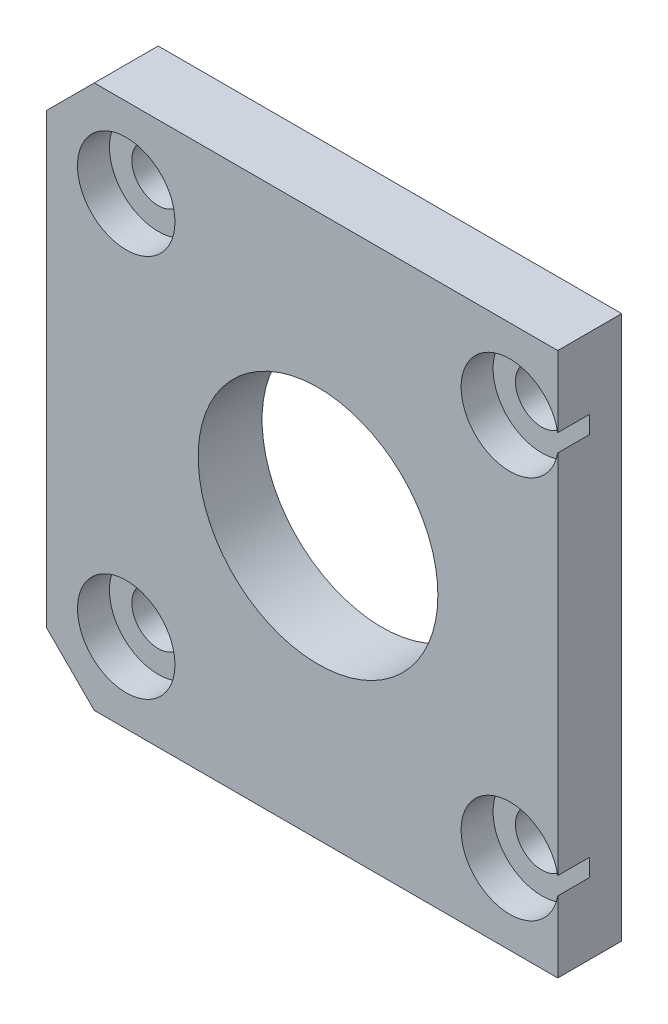
ISO-10303-21;
HEADER;
FILE_DESCRIPTION(('STEP AP214'),'2;1');
FILE_NAME('part.step','',(''),(''),'','','');
FILE_SCHEMA(('AUTOMOTIVE_DESIGN { 1 0 10303 214 1 1 1 1 }'));
ENDSEC;
DATA;
#1=APPLICATION_CONTEXT('core data for automotive mechanical design processes');
#2=APPLICATION_PROTOCOL_DEFINITION('international standard','automotive_design',2000,#1);
#3=PRODUCT_CONTEXT('',#1,'mechanical');
#4=PRODUCT('Part','Part','',(#3));
#5=PRODUCT_RELATED_PRODUCT_CATEGORY('part','',(#4));
#6=PRODUCT_DEFINITION_FORMATION('','',#4);
#7=PRODUCT_DEFINITION_CONTEXT('part definition',#1,'design');
#8=PRODUCT_DEFINITION('design','',#6,#7);
#9=PRODUCT_DEFINITION_SHAPE('','',#8);
#10=(LENGTH_UNIT() NAMED_UNIT(*) SI_UNIT(.MILLI.,.METRE.));
#11=(NAMED_UNIT(*) PLANE_ANGLE_UNIT() SI_UNIT($,.RADIAN.));
#12=(NAMED_UNIT(*) SI_UNIT($,.STERADIAN.) SOLID_ANGLE_UNIT());
#13=UNCERTAINTY_MEASURE_WITH_UNIT(LENGTH_MEASURE(1.E-05),#10,'distance_accuracy_value','');
#14=(GEOMETRIC_REPRESENTATION_CONTEXT(3) GLOBAL_UNCERTAINTY_ASSIGNED_CONTEXT((#13)) GLOBAL_UNIT_ASSIGNED_CONTEXT((#10,
#11,#12)) REPRESENTATION_CONTEXT('',''));
#15=CARTESIAN_POINT('',(0.,0.,0.));
#16=DIRECTION('',(0.,0.,1.));
#17=DIRECTION('',(1.,0.,0.));
#18=AXIS2_PLACEMENT_3D('',#15,#16,#17);
#19=CARTESIAN_POINT('',(5.,29.,4.));
#20=DIRECTION('',(0.,0.,-1.));
#21=DIRECTION('',(-1.,0.,0.));
#22=AXIS2_PLACEMENT_3D('',#19,#20,#21);
#23=CYLINDRICAL_SURFACE('',#22,1.65);
#24=CARTESIAN_POINT('',(5.,29.,0.));
#25=DIRECTION('',(0.,0.,1.));
#26=DIRECTION('',(1.,0.,0.));
#27=AXIS2_PLACEMENT_3D('',#24,#25,#26);
#28=CIRCLE('',#27,1.65);
#29=CARTESIAN_POINT('',(6.65,29.,0.));
#30=VERTEX_POINT('',#29);
#31=EDGE_CURVE('E271',#30,#30,#28,.T.);
#32=ORIENTED_EDGE('',*,*,#31,.F.);
#33=EDGE_LOOP('',(#32));
#34=FACE_BOUND('',#33,.T.);
#35=CARTESIAN_POINT('',(5.,29.,2.));
#36=DIRECTION('',(0.,0.,1.));
#37=DIRECTION('',(1.,0.,0.));
#38=AXIS2_PLACEMENT_3D('',#35,#36,#37);
#39=CIRCLE('',#38,1.65);
#40=CARTESIAN_POINT('',(6.65,29.,2.));
#41=VERTEX_POINT('',#40);
#42=EDGE_CURVE('E222',#41,#41,#39,.T.);
#43=ORIENTED_EDGE('',*,*,#42,.T.);
#44=EDGE_LOOP('',(#43));
#45=FACE_BOUND('',#44,.T.);
#46=ADVANCED_FACE('F39',(#34,#45),#23,.F.);
#47=CARTESIAN_POINT('',(29.,29.,4.));
#48=DIRECTION('',(0.,0.,-1.));
#49=DIRECTION('',(-1.,0.,0.));
#50=AXIS2_PLACEMENT_3D('',#47,#48,#49);
#51=CYLINDRICAL_SURFACE('',#50,1.65);
#52=CARTESIAN_POINT('',(29.,29.,0.));
#53=DIRECTION('',(0.,0.,1.));
#54=DIRECTION('',(1.,0.,0.));
#55=AXIS2_PLACEMENT_3D('',#52,#53,#54);
#56=CIRCLE('',#55,1.65);
#57=CARTESIAN_POINT('',(30.65,29.,0.));
#58=VERTEX_POINT('',#57);
#59=EDGE_CURVE('E267',#58,#58,#56,.T.);
#60=ORIENTED_EDGE('',*,*,#59,.F.);
#61=EDGE_LOOP('',(#60));
#62=FACE_BOUND('',#61,.T.);
#63=CARTESIAN_POINT('',(29.,29.,2.));
#64=DIRECTION('',(0.,0.,1.));
#65=DIRECTION('',(1.,0.,0.));
#66=AXIS2_PLACEMENT_3D('',#63,#64,#65);
#67=CIRCLE('',#66,1.65);
#68=CARTESIAN_POINT('',(30.65,29.,2.));
#69=VERTEX_POINT('',#68);
#70=EDGE_CURVE('E217',#69,#69,#67,.T.);
#71=ORIENTED_EDGE('',*,*,#70,.T.);
#72=EDGE_LOOP('',(#71));
#73=FACE_BOUND('',#72,.T.);
#74=ADVANCED_FACE('F301',(#62,#73),#51,.F.);
#75=CARTESIAN_POINT('',(5.,5.,4.));
#76=DIRECTION('',(0.,0.,-1.));
#77=DIRECTION('',(-1.,0.,0.));
#78=AXIS2_PLACEMENT_3D('',#75,#76,#77);
#79=CYLINDRICAL_SURFACE('',#78,1.65);
#80=CARTESIAN_POINT('',(5.,5.,0.));
#81=DIRECTION('',(0.,0.,1.));
#82=DIRECTION('',(1.,0.,0.));
#83=AXIS2_PLACEMENT_3D('',#80,#81,#82);
#84=CIRCLE('',#83,1.65);
#85=CARTESIAN_POINT('',(6.65,5.,0.));
#86=VERTEX_POINT('',#85);
#87=EDGE_CURVE('E263',#86,#86,#84,.T.);
#88=ORIENTED_EDGE('',*,*,#87,.F.);
#89=EDGE_LOOP('',(#88));
#90=FACE_BOUND('',#89,.T.);
#91=CARTESIAN_POINT('',(5.,5.,2.));
#92=DIRECTION('',(0.,0.,1.));
#93=DIRECTION('',(1.,0.,0.));
#94=AXIS2_PLACEMENT_3D('',#91,#92,#93);
#95=CIRCLE('',#94,1.65);
#96=CARTESIAN_POINT('',(6.65,5.,2.));
#97=VERTEX_POINT('',#96);
#98=EDGE_CURVE('E213',#97,#97,#95,.T.);
#99=ORIENTED_EDGE('',*,*,#98,.T.);
#100=EDGE_LOOP('',(#99));
#101=FACE_BOUND('',#100,.T.);
#102=ADVANCED_FACE('F306',(#90,#101),#79,.F.);
#103=CARTESIAN_POINT('',(29.,5.,4.));
#104=DIRECTION('',(0.,0.,-1.));
#105=DIRECTION('',(-1.,0.,0.));
#106=AXIS2_PLACEMENT_3D('',#103,#104,#105);
#107=CYLINDRICAL_SURFACE('',#106,1.65);
#108=CARTESIAN_POINT('',(29.,5.,0.));
#109=DIRECTION('',(0.,0.,1.));
#110=DIRECTION('',(1.,0.,0.));
#111=AXIS2_PLACEMENT_3D('',#108,#109,#110);
#112=CIRCLE('',#111,1.65);
#113=CARTESIAN_POINT('',(30.65,5.,0.));
#114=VERTEX_POINT('',#113);
#115=EDGE_CURVE('E225',#114,#114,#112,.T.);
#116=ORIENTED_EDGE('',*,*,#115,.F.);
#117=EDGE_LOOP('',(#116));
#118=FACE_BOUND('',#117,.T.);
#119=CARTESIAN_POINT('',(29.,5.,2.));
#120=DIRECTION('',(0.,0.,1.));
#121=DIRECTION('',(1.,0.,0.));
#122=AXIS2_PLACEMENT_3D('',#119,#120,#121);
#123=CIRCLE('',#122,1.65);
#124=CARTESIAN_POINT('',(30.65,5.,2.));
#125=VERTEX_POINT('',#124);
#126=EDGE_CURVE('E207',#125,#125,#123,.T.);
#127=ORIENTED_EDGE('',*,*,#126,.T.);
#128=EDGE_LOOP('',(#127));
#129=FACE_BOUND('',#128,.T.);
#130=ADVANCED_FACE('F314',(#118,#129),#107,.F.);
#131=CARTESIAN_POINT('',(0.,0.,4.));
#132=DIRECTION('',(0.,0.,-1.));
#133=DIRECTION('',(-1.,0.,0.));
#134=AXIS2_PLACEMENT_3D('',#131,#132,#133);
#135=PLANE('',#134);
#136=CARTESIAN_POINT('',(5.,5.,4.));
#137=DIRECTION('',(0.,0.,1.));
#138=DIRECTION('',(1.,0.,0.));
#139=AXIS2_PLACEMENT_3D('',#136,#137,#138);
#140=CIRCLE('',#139,3.05);
#141=CARTESIAN_POINT('',(8.05,5.,4.));
#142=VERTEX_POINT('',#141);
#143=EDGE_CURVE('E244',#142,#142,#140,.T.);
#144=ORIENTED_EDGE('',*,*,#143,.F.);
#145=EDGE_LOOP('',(#144));
#146=FACE_BOUND('',#145,.T.);
#147=CARTESIAN_POINT('',(5.,29.,4.));
#148=DIRECTION('',(0.,0.,1.));
#149=DIRECTION('',(1.,0.,0.));
#150=AXIS2_PLACEMENT_3D('',#147,#148,#149);
#151=CIRCLE('',#150,3.05);
#152=CARTESIAN_POINT('',(8.05,29.,4.));
#153=VERTEX_POINT('',#152);
#154=EDGE_CURVE('E241',#153,#153,#151,.T.);
#155=ORIENTED_EDGE('',*,*,#154,.F.);
#156=EDGE_LOOP('',(#155));
#157=FACE_BOUND('',#156,.T.);
#158=DIRECTION('',(0.,1.,0.));
#159=VECTOR('',#158,1.);
#160=CARTESIAN_POINT('',(32.,0.,4.));
#161=LINE('',#160,#159);
#162=CARTESIAN_POINT('',(32.,5.55000000000001,4.));
#163=VERTEX_POINT('',#162);
#164=CARTESIAN_POINT('',(32.,28.45,4.));
#165=VERTEX_POINT('',#164);
#166=EDGE_CURVE('E134',#163,#165,#161,.T.);
#167=ORIENTED_EDGE('',*,*,#166,.T.);
#168=CARTESIAN_POINT('',(29.,29.,4.));
#169=DIRECTION('',(0.,0.,1.));
#170=DIRECTION('',(1.,0.,0.));
#171=AXIS2_PLACEMENT_3D('',#168,#169,#170);
#172=CIRCLE('',#171,3.05);
#173=CARTESIAN_POINT('',(32.,29.55,4.));
#174=VERTEX_POINT('',#173);
#175=EDGE_CURVE('E234',#174,#165,#172,.T.);
#176=ORIENTED_EDGE('',*,*,#175,.F.);
#177=CARTESIAN_POINT('',(32.,34.,4.));
#178=VERTEX_POINT('',#177);
#179=EDGE_CURVE('E141',#174,#178,#161,.T.);
#180=ORIENTED_EDGE('',*,*,#179,.T.);
#181=DIRECTION('',(-1.,0.,0.));
#182=VECTOR('',#181,1.);
#183=CARTESIAN_POINT('',(3.,34.,4.));
#184=LINE('',#183,#182);
#185=CARTESIAN_POINT('',(3.,34.,4.));
#186=VERTEX_POINT('',#185);
#187=EDGE_CURVE('E145',#178,#186,#184,.T.);
#188=ORIENTED_EDGE('',*,*,#187,.T.);
#189=DIRECTION('',(-0.707106781186548,-0.707106781186547,0.));
#190=VECTOR('',#189,1.);
#191=CARTESIAN_POINT('',(0.,31.,4.));
#192=LINE('',#191,#190);
#193=CARTESIAN_POINT('',(0.,31.,4.));
#194=VERTEX_POINT('',#193);
#195=EDGE_CURVE('E153',#186,#194,#192,.T.);
#196=ORIENTED_EDGE('',*,*,#195,.T.);
#197=DIRECTION('',(0.,-1.,0.));
#198=VECTOR('',#197,1.);
#199=CARTESIAN_POINT('',(0.,3.,4.));
#200=LINE('',#199,#198);
#201=CARTESIAN_POINT('',(0.,3.,4.));
#202=VERTEX_POINT('',#201);
#203=EDGE_CURVE('E156',#194,#202,#200,.T.);
#204=ORIENTED_EDGE('',*,*,#203,.T.);
#205=DIRECTION('',(0.707106781186548,-0.707106781186548,0.));
#206=VECTOR('',#205,1.);
#207=CARTESIAN_POINT('',(0.,3.,4.));
#208=LINE('',#207,#206);
#209=CARTESIAN_POINT('',(3.,0.,4.));
#210=VERTEX_POINT('',#209);
#211=EDGE_CURVE('E159',#202,#210,#208,.T.);
#212=ORIENTED_EDGE('',*,*,#211,.T.);
#213=DIRECTION('',(1.,0.,0.));
#214=VECTOR('',#213,1.);
#215=CARTESIAN_POINT('',(3.,0.,4.));
#216=LINE('',#215,#214);
#217=CARTESIAN_POINT('',(32.,0.,4.));
#218=VERTEX_POINT('',#217);
#219=EDGE_CURVE('E162',#210,#218,#216,.T.);
#220=ORIENTED_EDGE('',*,*,#219,.T.);
#221=CARTESIAN_POINT('',(32.,4.44999999999999,4.));
#222=VERTEX_POINT('',#221);
#223=EDGE_CURVE('E136',#218,#222,#161,.T.);
#224=ORIENTED_EDGE('',*,*,#223,.T.);
#225=CARTESIAN_POINT('',(29.,5.,4.));
#226=DIRECTION('',(0.,0.,1.));
#227=DIRECTION('',(1.,0.,0.));
#228=AXIS2_PLACEMENT_3D('',#225,#226,#227);
#229=CIRCLE('',#228,3.05);
#230=EDGE_CURVE('E119',#163,#222,#229,.T.);
#231=ORIENTED_EDGE('',*,*,#230,.F.);
#232=EDGE_LOOP('',(#167,#176,#180,#188,#196,#204,#212,#220,#224,#231));
#233=FACE_BOUND('',#232,.T.);
#234=CARTESIAN_POINT('',(17.,17.,4.));
#235=DIRECTION('',(0.,0.,1.));
#236=DIRECTION('',(1.,0.,0.));
#237=AXIS2_PLACEMENT_3D('',#234,#235,#236);
#238=CIRCLE('',#237,7.5);
#239=CARTESIAN_POINT('',(24.5,17.,4.));
#240=VERTEX_POINT('',#239);
#241=EDGE_CURVE('E171',#240,#240,#238,.T.);
#242=ORIENTED_EDGE('',*,*,#241,.F.);
#243=EDGE_LOOP('',(#242));
#244=FACE_BOUND('',#243,.T.);
#245=ADVANCED_FACE('F131',(#146,#157,#233,#244),#135,.F.);
#246=CARTESIAN_POINT('',(0.,0.,0.));
#247=DIRECTION('',(0.,0.,-1.));
#248=DIRECTION('',(-1.,0.,0.));
#249=AXIS2_PLACEMENT_3D('',#246,#247,#248);
#250=PLANE('',#249);
#251=ORIENTED_EDGE('',*,*,#87,.T.);
#252=EDGE_LOOP('',(#251));
#253=FACE_BOUND('',#252,.T.);
#254=ORIENTED_EDGE('',*,*,#31,.T.);
#255=EDGE_LOOP('',(#254));
#256=FACE_BOUND('',#255,.T.);
#257=DIRECTION('',(0.,1.,0.));
#258=VECTOR('',#257,1.);
#259=CARTESIAN_POINT('',(32.,0.,0.));
#260=LINE('',#259,#258);
#261=CARTESIAN_POINT('',(32.,0.,0.));
#262=VERTEX_POINT('',#261);
#263=CARTESIAN_POINT('',(32.,34.,0.));
#264=VERTEX_POINT('',#263);
#265=EDGE_CURVE('E166',#262,#264,#260,.T.);
#266=ORIENTED_EDGE('',*,*,#265,.F.);
#267=DIRECTION('',(1.,0.,0.));
#268=VECTOR('',#267,1.);
#269=CARTESIAN_POINT('',(3.,0.,0.));
#270=LINE('',#269,#268);
#271=CARTESIAN_POINT('',(3.,0.,0.));
#272=VERTEX_POINT('',#271);
#273=EDGE_CURVE('E146',#272,#262,#270,.T.);
#274=ORIENTED_EDGE('',*,*,#273,.F.);
#275=DIRECTION('',(0.707106781186548,-0.707106781186548,0.));
#276=VECTOR('',#275,1.);
#277=CARTESIAN_POINT('',(0.,3.,0.));
#278=LINE('',#277,#276);
#279=CARTESIAN_POINT('',(0.,3.,0.));
#280=VERTEX_POINT('',#279);
#281=EDGE_CURVE('E180',#280,#272,#278,.T.);
#282=ORIENTED_EDGE('',*,*,#281,.F.);
#283=DIRECTION('',(0.,-1.,0.));
#284=VECTOR('',#283,1.);
#285=CARTESIAN_POINT('',(0.,3.,0.));
#286=LINE('',#285,#284);
#287=CARTESIAN_POINT('',(0.,31.,0.));
#288=VERTEX_POINT('',#287);
#289=EDGE_CURVE('E177',#288,#280,#286,.T.);
#290=ORIENTED_EDGE('',*,*,#289,.F.);
#291=DIRECTION('',(-0.707106781186548,-0.707106781186547,0.));
#292=VECTOR('',#291,1.);
#293=CARTESIAN_POINT('',(0.,31.,0.));
#294=LINE('',#293,#292);
#295=CARTESIAN_POINT('',(3.,34.,0.));
#296=VERTEX_POINT('',#295);
#297=EDGE_CURVE('E174',#296,#288,#294,.T.);
#298=ORIENTED_EDGE('',*,*,#297,.F.);
#299=DIRECTION('',(-1.,0.,0.));
#300=VECTOR('',#299,1.);
#301=CARTESIAN_POINT('',(3.,34.,0.));
#302=LINE('',#301,#300);
#303=EDGE_CURVE('E170',#264,#296,#302,.T.);
#304=ORIENTED_EDGE('',*,*,#303,.F.);
#305=EDGE_LOOP('',(#266,#274,#282,#290,#298,#304));
#306=FACE_BOUND('',#305,.T.);
#307=CARTESIAN_POINT('',(17.,17.,0.));
#308=DIRECTION('',(0.,0.,1.));
#309=DIRECTION('',(1.,0.,0.));
#310=AXIS2_PLACEMENT_3D('',#307,#308,#309);
#311=CIRCLE('',#310,7.5);
#312=CARTESIAN_POINT('',(24.5,17.,0.));
#313=VERTEX_POINT('',#312);
#314=EDGE_CURVE('E149',#313,#313,#311,.T.);
#315=ORIENTED_EDGE('',*,*,#314,.T.);
#316=EDGE_LOOP('',(#315));
#317=FACE_BOUND('',#316,.T.);
#318=ORIENTED_EDGE('',*,*,#59,.T.);
#319=EDGE_LOOP('',(#318));
#320=FACE_BOUND('',#319,.T.);
#321=ORIENTED_EDGE('',*,*,#115,.T.);
#322=EDGE_LOOP('',(#321));
#323=FACE_BOUND('',#322,.T.);
#324=ADVANCED_FACE('F282',(#253,#256,#306,#317,#320,#323),#250,.T.);
#325=CARTESIAN_POINT('',(32.,0.,4.));
#326=DIRECTION('',(-1.,0.,0.));
#327=DIRECTION('',(0.,0.,1.));
#328=AXIS2_PLACEMENT_3D('',#325,#326,#327);
#329=PLANE('',#328);
#330=DIRECTION('',(0.,1.,0.));
#331=VECTOR('',#330,1.);
#332=CARTESIAN_POINT('',(32.,0.,2.));
#333=LINE('',#332,#331);
#334=CARTESIAN_POINT('',(32.,28.45,2.));
#335=VERTEX_POINT('',#334);
#336=CARTESIAN_POINT('',(32.,29.55,2.));
#337=VERTEX_POINT('',#336);
#338=EDGE_CURVE('E221',#335,#337,#333,.T.);
#339=ORIENTED_EDGE('',*,*,#338,.F.);
#340=DIRECTION('',(0.,0.,1.));
#341=VECTOR('',#340,1.);
#342=CARTESIAN_POINT('',(32.,28.45,2.));
#343=LINE('',#342,#341);
#344=EDGE_CURVE('E11',#335,#165,#343,.T.);
#345=ORIENTED_EDGE('',*,*,#344,.T.);
#346=ORIENTED_EDGE('',*,*,#166,.F.);
#347=DIRECTION('',(0.,0.,1.));
#348=VECTOR('',#347,1.);
#349=CARTESIAN_POINT('',(32.,5.55000000000001,2.));
#350=LINE('',#349,#348);
#351=CARTESIAN_POINT('',(32.,5.55000000000001,2.));
#352=VERTEX_POINT('',#351);
#353=EDGE_CURVE('E116',#163,#352,#350,.F.);
#354=ORIENTED_EDGE('',*,*,#353,.T.);
#355=DIRECTION('',(0.,1.,0.));
#356=VECTOR('',#355,1.);
#357=CARTESIAN_POINT('',(32.,0.,2.));
#358=LINE('',#357,#356);
#359=CARTESIAN_POINT('',(32.,4.44999999999999,2.));
#360=VERTEX_POINT('',#359);
#361=EDGE_CURVE('E211',#360,#352,#358,.T.);
#362=ORIENTED_EDGE('',*,*,#361,.F.);
#363=DIRECTION('',(0.,0.,1.));
#364=VECTOR('',#363,1.);
#365=CARTESIAN_POINT('',(32.,4.44999999999999,2.));
#366=LINE('',#365,#364);
#367=EDGE_CURVE('E125',#360,#222,#366,.T.);
#368=ORIENTED_EDGE('',*,*,#367,.T.);
#369=ORIENTED_EDGE('',*,*,#223,.F.);
#370=DIRECTION('',(0.,0.,-1.));
#371=VECTOR('',#370,1.);
#372=CARTESIAN_POINT('',(32.,0.,4.));
#373=LINE('',#372,#371);
#374=EDGE_CURVE('E165',#218,#262,#373,.T.);
#375=ORIENTED_EDGE('',*,*,#374,.T.);
#376=ORIENTED_EDGE('',*,*,#265,.T.);
#377=DIRECTION('',(0.,0.,-1.));
#378=VECTOR('',#377,1.);
#379=CARTESIAN_POINT('',(32.,34.,4.));
#380=LINE('',#379,#378);
#381=EDGE_CURVE('E126',#178,#264,#380,.T.);
#382=ORIENTED_EDGE('',*,*,#381,.F.);
#383=ORIENTED_EDGE('',*,*,#179,.F.);
#384=DIRECTION('',(0.,0.,1.));
#385=VECTOR('',#384,1.);
#386=CARTESIAN_POINT('',(32.,29.55,2.));
#387=LINE('',#386,#385);
#388=EDGE_CURVE('E48',#174,#337,#387,.F.);
#389=ORIENTED_EDGE('',*,*,#388,.T.);
#390=EDGE_LOOP('',(#339,#345,#346,#354,#362,#368,#369,#375,#376,#382,#383,#389));
#391=FACE_BOUND('',#390,.T.);
#392=ADVANCED_FACE('F41',(#391),#329,.F.);
#393=CARTESIAN_POINT('',(3.,34.,4.));
#394=DIRECTION('',(0.,-1.,0.));
#395=DIRECTION('',(0.,0.,-1.));
#396=AXIS2_PLACEMENT_3D('',#393,#394,#395);
#397=PLANE('',#396);
#398=ORIENTED_EDGE('',*,*,#303,.T.);
#399=DIRECTION('',(0.,0.,-1.));
#400=VECTOR('',#399,1.);
#401=CARTESIAN_POINT('',(3.,34.,4.));
#402=LINE('',#401,#400);
#403=EDGE_CURVE('E200',#186,#296,#402,.T.);
#404=ORIENTED_EDGE('',*,*,#403,.F.);
#405=ORIENTED_EDGE('',*,*,#187,.F.);
#406=ORIENTED_EDGE('',*,*,#381,.T.);
#407=EDGE_LOOP('',(#398,#404,#405,#406));
#408=FACE_BOUND('',#407,.T.);
#409=ADVANCED_FACE('F356',(#408),#397,.F.);
#410=CARTESIAN_POINT('',(0.,31.,4.));
#411=DIRECTION('',(0.707106781186547,-0.707106781186548,0.));
#412=DIRECTION('',(0.707106781186548,0.707106781186547,0.));
#413=AXIS2_PLACEMENT_3D('',#410,#411,#412);
#414=PLANE('',#413);
#415=ORIENTED_EDGE('',*,*,#297,.T.);
#416=DIRECTION('',(0.,0.,-1.));
#417=VECTOR('',#416,1.);
#418=CARTESIAN_POINT('',(0.,31.,4.));
#419=LINE('',#418,#417);
#420=EDGE_CURVE('E196',#194,#288,#419,.T.);
#421=ORIENTED_EDGE('',*,*,#420,.F.);
#422=ORIENTED_EDGE('',*,*,#195,.F.);
#423=ORIENTED_EDGE('',*,*,#403,.T.);
#424=EDGE_LOOP('',(#415,#421,#422,#423));
#425=FACE_BOUND('',#424,.T.);
#426=ADVANCED_FACE('F362',(#425),#414,.F.);
#427=CARTESIAN_POINT('',(0.,3.,4.));
#428=DIRECTION('',(1.,0.,0.));
#429=DIRECTION('',(0.,0.,-1.));
#430=AXIS2_PLACEMENT_3D('',#427,#428,#429);
#431=PLANE('',#430);
#432=ORIENTED_EDGE('',*,*,#289,.T.);
#433=DIRECTION('',(0.,0.,-1.));
#434=VECTOR('',#433,1.);
#435=CARTESIAN_POINT('',(0.,3.,4.));
#436=LINE('',#435,#434);
#437=EDGE_CURVE('E192',#202,#280,#436,.T.);
#438=ORIENTED_EDGE('',*,*,#437,.F.);
#439=ORIENTED_EDGE('',*,*,#203,.F.);
#440=ORIENTED_EDGE('',*,*,#420,.T.);
#441=EDGE_LOOP('',(#432,#438,#439,#440));
#442=FACE_BOUND('',#441,.T.);
#443=ADVANCED_FACE('F364',(#442),#431,.F.);
#444=CARTESIAN_POINT('',(0.,3.,4.));
#445=DIRECTION('',(0.707106781186547,0.707106781186547,0.));
#446=DIRECTION('',(-0.707106781186548,0.707106781186548,0.));
#447=AXIS2_PLACEMENT_3D('',#444,#445,#446);
#448=PLANE('',#447);
#449=ORIENTED_EDGE('',*,*,#281,.T.);
#450=DIRECTION('',(0.,0.,-1.));
#451=VECTOR('',#450,1.);
#452=CARTESIAN_POINT('',(3.,0.,4.));
#453=LINE('',#452,#451);
#454=EDGE_CURVE('E188',#210,#272,#453,.T.);
#455=ORIENTED_EDGE('',*,*,#454,.F.);
#456=ORIENTED_EDGE('',*,*,#211,.F.);
#457=ORIENTED_EDGE('',*,*,#437,.T.);
#458=EDGE_LOOP('',(#449,#455,#456,#457));
#459=FACE_BOUND('',#458,.T.);
#460=ADVANCED_FACE('F295',(#459),#448,.F.);
#461=CARTESIAN_POINT('',(3.,0.,4.));
#462=DIRECTION('',(0.,1.,0.));
#463=DIRECTION('',(0.,0.,1.));
#464=AXIS2_PLACEMENT_3D('',#461,#462,#463);
#465=PLANE('',#464);
#466=ORIENTED_EDGE('',*,*,#273,.T.);
#467=ORIENTED_EDGE('',*,*,#374,.F.);
#468=ORIENTED_EDGE('',*,*,#219,.F.);
#469=ORIENTED_EDGE('',*,*,#454,.T.);
#470=EDGE_LOOP('',(#466,#467,#468,#469));
#471=FACE_BOUND('',#470,.T.);
#472=ADVANCED_FACE('F287',(#471),#465,.F.);
#473=CARTESIAN_POINT('',(17.,17.,4.));
#474=DIRECTION('',(0.,0.,-1.));
#475=DIRECTION('',(-1.,0.,0.));
#476=AXIS2_PLACEMENT_3D('',#473,#474,#475);
#477=CYLINDRICAL_SURFACE('',#476,7.5);
#478=ORIENTED_EDGE('',*,*,#241,.T.);
#479=EDGE_LOOP('',(#478));
#480=FACE_BOUND('',#479,.T.);
#481=ORIENTED_EDGE('',*,*,#314,.F.);
#482=EDGE_LOOP('',(#481));
#483=FACE_BOUND('',#482,.T.);
#484=ADVANCED_FACE('F285',(#480,#483),#477,.F.);
#485=CARTESIAN_POINT('',(29.,5.,2.));
#486=DIRECTION('',(0.,0.,1.));
#487=DIRECTION('',(1.,0.,0.));
#488=AXIS2_PLACEMENT_3D('',#485,#486,#487);
#489=CYLINDRICAL_SURFACE('',#488,3.05);
#490=CARTESIAN_POINT('',(29.,5.,2.));
#491=DIRECTION('',(0.,0.,1.));
#492=DIRECTION('',(1.,0.,0.));
#493=AXIS2_PLACEMENT_3D('',#490,#491,#492);
#494=CIRCLE('',#493,3.05);
#495=EDGE_CURVE('E61',#352,#360,#494,.T.);
#496=ORIENTED_EDGE('',*,*,#495,.F.);
#497=ORIENTED_EDGE('',*,*,#353,.F.);
#498=ORIENTED_EDGE('',*,*,#230,.T.);
#499=ORIENTED_EDGE('',*,*,#367,.F.);
#500=EDGE_LOOP('',(#496,#497,#498,#499));
#501=FACE_BOUND('',#500,.T.);
#502=ADVANCED_FACE('F118',(#501),#489,.F.);
#503=CARTESIAN_POINT('',(29.,5.,2.));
#504=DIRECTION('',(0.,0.,1.));
#505=DIRECTION('',(1.,0.,0.));
#506=AXIS2_PLACEMENT_3D('',#503,#504,#505);
#507=PLANE('',#506);
#508=ORIENTED_EDGE('',*,*,#126,.F.);
#509=EDGE_LOOP('',(#508));
#510=FACE_BOUND('',#509,.T.);
#511=ORIENTED_EDGE('',*,*,#361,.T.);
#512=ORIENTED_EDGE('',*,*,#495,.T.);
#513=EDGE_LOOP('',(#511,#512));
#514=FACE_BOUND('',#513,.T.);
#515=ADVANCED_FACE('F293',(#510,#514),#507,.T.);
#516=CARTESIAN_POINT('',(5.,5.,2.));
#517=DIRECTION('',(0.,0.,1.));
#518=DIRECTION('',(1.,0.,0.));
#519=AXIS2_PLACEMENT_3D('',#516,#517,#518);
#520=CYLINDRICAL_SURFACE('',#519,3.05);
#521=CARTESIAN_POINT('',(5.,5.,2.));
#522=DIRECTION('',(0.,0.,1.));
#523=DIRECTION('',(1.,0.,0.));
#524=AXIS2_PLACEMENT_3D('',#521,#522,#523);
#525=CIRCLE('',#524,3.05);
#526=CARTESIAN_POINT('',(8.05,5.,2.));
#527=VERTEX_POINT('',#526);
#528=EDGE_CURVE('E237',#527,#527,#525,.T.);
#529=ORIENTED_EDGE('',*,*,#528,.F.);
#530=EDGE_LOOP('',(#529));
#531=FACE_BOUND('',#530,.T.);
#532=ORIENTED_EDGE('',*,*,#143,.T.);
#533=EDGE_LOOP('',(#532));
#534=FACE_BOUND('',#533,.T.);
#535=ADVANCED_FACE('F328',(#531,#534),#520,.F.);
#536=CARTESIAN_POINT('',(5.,5.,2.));
#537=DIRECTION('',(0.,0.,1.));
#538=DIRECTION('',(1.,0.,0.));
#539=AXIS2_PLACEMENT_3D('',#536,#537,#538);
#540=PLANE('',#539);
#541=ORIENTED_EDGE('',*,*,#98,.F.);
#542=EDGE_LOOP('',(#541));
#543=FACE_BOUND('',#542,.T.);
#544=ORIENTED_EDGE('',*,*,#528,.T.);
#545=EDGE_LOOP('',(#544));
#546=FACE_BOUND('',#545,.T.);
#547=ADVANCED_FACE('F331',(#543,#546),#540,.T.);
#548=CARTESIAN_POINT('',(29.,29.,2.));
#549=DIRECTION('',(0.,0.,1.));
#550=DIRECTION('',(1.,0.,0.));
#551=AXIS2_PLACEMENT_3D('',#548,#549,#550);
#552=CYLINDRICAL_SURFACE('',#551,3.05);
#553=CARTESIAN_POINT('',(29.,29.,2.));
#554=DIRECTION('',(0.,0.,1.));
#555=DIRECTION('',(1.,0.,0.));
#556=AXIS2_PLACEMENT_3D('',#553,#554,#555);
#557=CIRCLE('',#556,3.05);
#558=EDGE_CURVE('E54',#337,#335,#557,.T.);
#559=ORIENTED_EDGE('',*,*,#558,.F.);
#560=ORIENTED_EDGE('',*,*,#388,.F.);
#561=ORIENTED_EDGE('',*,*,#175,.T.);
#562=ORIENTED_EDGE('',*,*,#344,.F.);
#563=EDGE_LOOP('',(#559,#560,#561,#562));
#564=FACE_BOUND('',#563,.T.);
#565=ADVANCED_FACE('F233',(#564),#552,.F.);
#566=CARTESIAN_POINT('',(29.,29.,2.));
#567=DIRECTION('',(0.,0.,1.));
#568=DIRECTION('',(1.,0.,0.));
#569=AXIS2_PLACEMENT_3D('',#566,#567,#568);
#570=PLANE('',#569);
#571=ORIENTED_EDGE('',*,*,#70,.F.);
#572=EDGE_LOOP('',(#571));
#573=FACE_BOUND('',#572,.T.);
#574=ORIENTED_EDGE('',*,*,#338,.T.);
#575=ORIENTED_EDGE('',*,*,#558,.T.);
#576=EDGE_LOOP('',(#574,#575));
#577=FACE_BOUND('',#576,.T.);
#578=ADVANCED_FACE('F323',(#573,#577),#570,.T.);
#579=CARTESIAN_POINT('',(5.,29.,2.));
#580=DIRECTION('',(0.,0.,1.));
#581=DIRECTION('',(1.,0.,0.));
#582=AXIS2_PLACEMENT_3D('',#579,#580,#581);
#583=CYLINDRICAL_SURFACE('',#582,3.05);
#584=CARTESIAN_POINT('',(5.,29.,2.));
#585=DIRECTION('',(0.,0.,1.));
#586=DIRECTION('',(1.,0.,0.));
#587=AXIS2_PLACEMENT_3D('',#584,#585,#586);
#588=CIRCLE('',#587,3.05);
#589=CARTESIAN_POINT('',(8.05,29.,2.));
#590=VERTEX_POINT('',#589);
#591=EDGE_CURVE('E212',#590,#590,#588,.T.);
#592=ORIENTED_EDGE('',*,*,#591,.F.);
#593=EDGE_LOOP('',(#592));
#594=FACE_BOUND('',#593,.T.);
#595=ORIENTED_EDGE('',*,*,#154,.T.);
#596=EDGE_LOOP('',(#595));
#597=FACE_BOUND('',#596,.T.);
#598=ADVANCED_FACE('F319',(#594,#597),#583,.F.);
#599=CARTESIAN_POINT('',(5.,29.,2.));
#600=DIRECTION('',(0.,0.,1.));
#601=DIRECTION('',(1.,0.,0.));
#602=AXIS2_PLACEMENT_3D('',#599,#600,#601);
#603=PLANE('',#602);
#604=ORIENTED_EDGE('',*,*,#42,.F.);
#605=EDGE_LOOP('',(#604));
#606=FACE_BOUND('',#605,.T.);
#607=ORIENTED_EDGE('',*,*,#591,.T.);
#608=EDGE_LOOP('',(#607));
#609=FACE_BOUND('',#608,.T.);
#610=ADVANCED_FACE('F322',(#606,#609),#603,.T.);
#611=CLOSED_SHELL('',(#46,#74,#102,#130,#245,#324,#392,#409,#426,#443,#460,#472,#484,#502,#515,
#535,#547,#565,#578,#598,#610));
#612=MANIFOLD_SOLID_BREP('B2',#611);
#613=ADVANCED_BREP_SHAPE_REPRESENTATION('',(#18,#612),#14);
#614=SHAPE_DEFINITION_REPRESENTATION(#9,#613);
ENDSEC;
END-ISO-10303-21;
